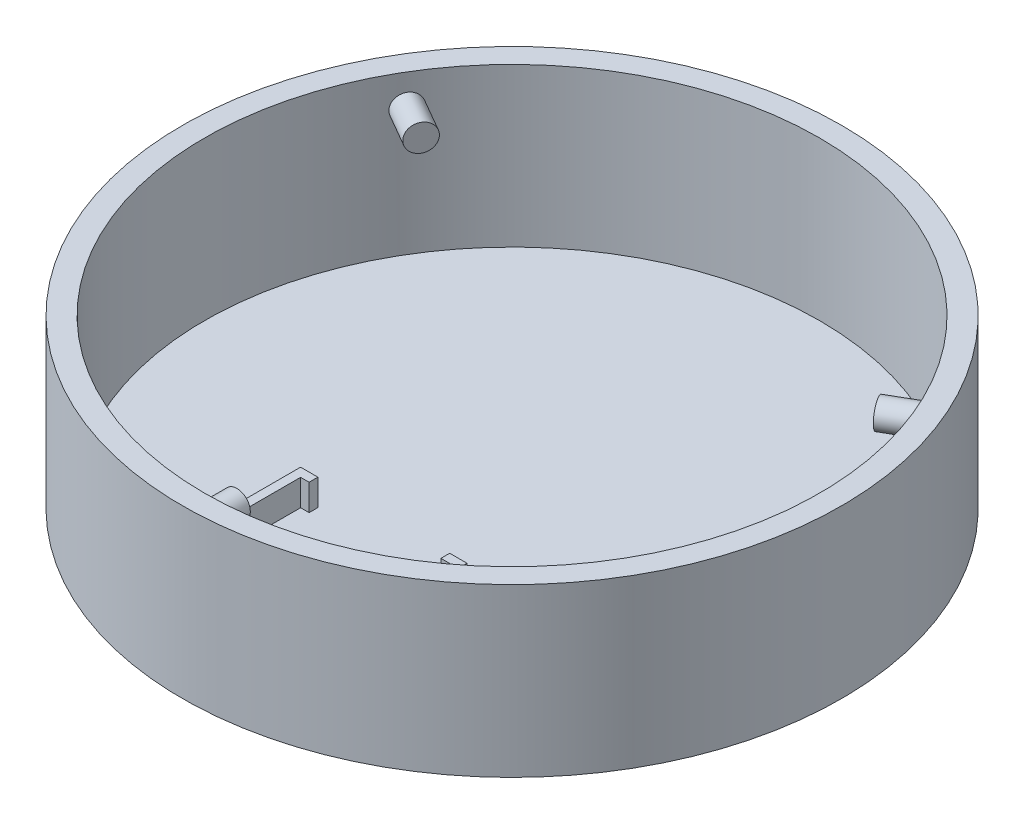
ISO-10303-21;
HEADER;
FILE_DESCRIPTION(('STEP AP214'),'2;1');
FILE_NAME('part.step','',(''),(''),'','','');
FILE_SCHEMA(('AUTOMOTIVE_DESIGN { 1 0 10303 214 1 1 1 1 }'));
ENDSEC;
DATA;
#1=APPLICATION_CONTEXT('core data for automotive mechanical design processes');
#2=APPLICATION_PROTOCOL_DEFINITION('international standard','automotive_design',2000,#1);
#3=PRODUCT_CONTEXT('',#1,'mechanical');
#4=PRODUCT('Part','Part','',(#3));
#5=PRODUCT_RELATED_PRODUCT_CATEGORY('part','',(#4));
#6=PRODUCT_DEFINITION_FORMATION('','',#4);
#7=PRODUCT_DEFINITION_CONTEXT('part definition',#1,'design');
#8=PRODUCT_DEFINITION('design','',#6,#7);
#9=PRODUCT_DEFINITION_SHAPE('','',#8);
#10=(LENGTH_UNIT() NAMED_UNIT(*) SI_UNIT(.MILLI.,.METRE.));
#11=(NAMED_UNIT(*) PLANE_ANGLE_UNIT() SI_UNIT($,.RADIAN.));
#12=(NAMED_UNIT(*) SI_UNIT($,.STERADIAN.) SOLID_ANGLE_UNIT());
#13=UNCERTAINTY_MEASURE_WITH_UNIT(LENGTH_MEASURE(1.E-05),#10,'distance_accuracy_value','');
#14=(GEOMETRIC_REPRESENTATION_CONTEXT(3) GLOBAL_UNCERTAINTY_ASSIGNED_CONTEXT((#13)) GLOBAL_UNIT_ASSIGNED_CONTEXT((#10,
#11,#12)) REPRESENTATION_CONTEXT('',''));
#15=CARTESIAN_POINT('',(0.,0.,0.));
#16=DIRECTION('',(0.,0.,1.));
#17=DIRECTION('',(1.,0.,0.));
#18=AXIS2_PLACEMENT_3D('',#15,#16,#17);
#19=CARTESIAN_POINT('',(17.3810889466934,10.16,30.4071253878576));
#20=DIRECTION('',(0.,0.,1.));
#21=DIRECTION('',(1.,0.,0.));
#22=AXIS2_PLACEMENT_3D('',#19,#20,#21);
#23=PLANE('',#22);
#24=DIRECTION('',(-1.,0.,0.));
#25=VECTOR('',#24,1.);
#26=CARTESIAN_POINT('',(17.3810889466934,10.16,30.4071253878576));
#27=LINE('',#26,#25);
#28=CARTESIAN_POINT('',(-25.7149110533066,10.16,30.4071253878576));
#29=VERTEX_POINT('',#28);
#30=CARTESIAN_POINT('',(-30.7149110533066,10.16,30.4071253878576));
#31=VERTEX_POINT('',#30);
#32=EDGE_CURVE('E197',#29,#31,#27,.T.);
#33=ORIENTED_EDGE('',*,*,#32,.F.);
#34=DIRECTION('',(0.,1.,0.));
#35=VECTOR('',#34,1.);
#36=CARTESIAN_POINT('',(-25.7149110533066,2.54,30.4071253878576));
#37=LINE('',#36,#35);
#38=CARTESIAN_POINT('',(-25.7149110533066,2.54,30.4071253878576));
#39=VERTEX_POINT('',#38);
#40=EDGE_CURVE('E189',#39,#29,#37,.T.);
#41=ORIENTED_EDGE('',*,*,#40,.F.);
#42=DIRECTION('',(-1.,0.,0.));
#43=VECTOR('',#42,1.);
#44=CARTESIAN_POINT('',(17.3810889466934,2.54,30.4071253878576));
#45=LINE('',#44,#43);
#46=CARTESIAN_POINT('',(-30.7149110533066,2.54,30.4071253878576));
#47=VERTEX_POINT('',#46);
#48=EDGE_CURVE('E216',#39,#47,#45,.T.);
#49=ORIENTED_EDGE('',*,*,#48,.T.);
#50=DIRECTION('',(0.,-1.,0.));
#51=VECTOR('',#50,1.);
#52=CARTESIAN_POINT('',(-30.7149110533066,10.16,30.4071253878576));
#53=LINE('',#52,#51);
#54=EDGE_CURVE('E232',#31,#47,#53,.T.);
#55=ORIENTED_EDGE('',*,*,#54,.F.);
#56=EDGE_LOOP('',(#33,#41,#49,#55));
#57=FACE_BOUND('',#56,.T.);
#58=ADVANCED_FACE('F69',(#57),#23,.F.);
#59=CARTESIAN_POINT('',(14.8410889466934,10.16,32.9471253878576));
#60=DIRECTION('',(0.,0.,1.));
#61=DIRECTION('',(1.,0.,0.));
#62=AXIS2_PLACEMENT_3D('',#59,#60,#61);
#63=PLANE('',#62);
#64=DIRECTION('',(0.,1.,0.));
#65=VECTOR('',#64,1.);
#66=CARTESIAN_POINT('',(-25.7149110533066,2.54,32.9471253878576));
#67=LINE('',#66,#65);
#68=CARTESIAN_POINT('',(-25.7149110533066,2.54,32.9471253878576));
#69=VERTEX_POINT('',#68);
#70=CARTESIAN_POINT('',(-25.7149110533066,10.16,32.9471253878576));
#71=VERTEX_POINT('',#70);
#72=EDGE_CURVE('E402',#69,#71,#67,.T.);
#73=ORIENTED_EDGE('',*,*,#72,.T.);
#74=DIRECTION('',(-1.,0.,0.));
#75=VECTOR('',#74,1.);
#76=CARTESIAN_POINT('',(14.8410889466934,10.16,32.9471253878576));
#77=LINE('',#76,#75);
#78=CARTESIAN_POINT('',(-28.1749110533066,10.16,32.9471253878576));
#79=VERTEX_POINT('',#78);
#80=EDGE_CURVE('E356',#71,#79,#77,.T.);
#81=ORIENTED_EDGE('',*,*,#80,.T.);
#82=DIRECTION('',(0.,-1.,0.));
#83=VECTOR('',#82,1.);
#84=CARTESIAN_POINT('',(-28.1749110533066,10.16,32.9471253878576));
#85=LINE('',#84,#83);
#86=CARTESIAN_POINT('',(-28.1749110533066,2.54,32.9471253878576));
#87=VERTEX_POINT('',#86);
#88=EDGE_CURVE('E205',#79,#87,#85,.T.);
#89=ORIENTED_EDGE('',*,*,#88,.T.);
#90=DIRECTION('',(-1.,0.,0.));
#91=VECTOR('',#90,1.);
#92=CARTESIAN_POINT('',(14.8410889466934,2.54,32.9471253878576));
#93=LINE('',#92,#91);
#94=EDGE_CURVE('E343',#69,#87,#93,.T.);
#95=ORIENTED_EDGE('',*,*,#94,.F.);
#96=EDGE_LOOP('',(#73,#81,#89,#95));
#97=FACE_BOUND('',#96,.T.);
#98=ADVANCED_FACE('F298',(#97),#63,.T.);
#99=CARTESIAN_POINT('',(0.,48.26,0.));
#100=DIRECTION('',(0.,-1.,0.));
#101=DIRECTION('',(0.,0.,-1.));
#102=AXIS2_PLACEMENT_3D('',#99,#100,#101);
#103=CYLINDRICAL_SURFACE('',#102,95.25);
#104=CARTESIAN_POINT('',(0.,48.26,0.));
#105=DIRECTION('',(0.,1.,0.));
#106=DIRECTION('',(0.,0.,1.));
#107=AXIS2_PLACEMENT_3D('',#104,#105,#106);
#108=CIRCLE('',#107,95.25);
#109=CARTESIAN_POINT('',(0.,48.26,-95.25));
#110=VERTEX_POINT('',#109);
#111=EDGE_CURVE('E12',#110,#110,#108,.T.);
#112=CARTESIAN_POINT('',(0.,0.,0.));
#113=DIRECTION('',(0.,1.,0.));
#114=DIRECTION('',(0.,0.,1.));
#115=AXIS2_PLACEMENT_3D('',#112,#113,#114);
#116=CIRCLE('',#115,95.25);
#117=CARTESIAN_POINT('',(0.,0.,-95.25));
#118=VERTEX_POINT('',#117);
#119=EDGE_CURVE('E84',#118,#118,#116,.T.);
#120=CARTESIAN_POINT('',(0.,48.26,-95.25));
#121=CARTESIAN_POINT('',(0.,47.7572916666667,-95.25));
#122=CARTESIAN_POINT('',(0.,47.2545833333333,-95.25));
#123=CARTESIAN_POINT('',(0.,46.2491666666667,-95.25));
#124=CARTESIAN_POINT('',(0.,45.7464583333333,-95.25));
#125=CARTESIAN_POINT('',(0.,44.7410416666667,-95.25));
#126=CARTESIAN_POINT('',(0.,44.2383333333333,-95.25));
#127=CARTESIAN_POINT('',(0.,43.2329166666667,-95.25));
#128=CARTESIAN_POINT('',(0.,42.7302083333333,-95.25));
#129=CARTESIAN_POINT('',(0.,41.7247916666667,-95.25));
#130=CARTESIAN_POINT('',(0.,41.2220833333333,-95.25));
#131=CARTESIAN_POINT('',(0.,40.2166666666667,-95.25));
#132=CARTESIAN_POINT('',(0.,39.7139583333333,-95.25));
#133=CARTESIAN_POINT('',(0.,38.7085416666667,-95.25));
#134=CARTESIAN_POINT('',(0.,38.2058333333333,-95.25));
#135=CARTESIAN_POINT('',(0.,37.2004166666667,-95.25));
#136=CARTESIAN_POINT('',(0.,36.6977083333333,-95.25));
#137=CARTESIAN_POINT('',(0.,35.6922916666667,-95.25));
#138=CARTESIAN_POINT('',(0.,35.1895833333333,-95.25));
#139=CARTESIAN_POINT('',(0.,34.1841666666667,-95.25));
#140=CARTESIAN_POINT('',(0.,33.6814583333333,-95.25));
#141=CARTESIAN_POINT('',(0.,32.6760416666667,-95.25));
#142=CARTESIAN_POINT('',(0.,32.1733333333333,-95.25));
#143=CARTESIAN_POINT('',(0.,31.1679166666667,-95.25));
#144=CARTESIAN_POINT('',(0.,30.6652083333333,-95.25));
#145=CARTESIAN_POINT('',(0.,29.6597916666667,-95.25));
#146=CARTESIAN_POINT('',(0.,29.1570833333333,-95.25));
#147=CARTESIAN_POINT('',(0.,28.1516666666667,-95.25));
#148=CARTESIAN_POINT('',(0.,27.6489583333333,-95.25));
#149=CARTESIAN_POINT('',(0.,26.6435416666667,-95.25));
#150=CARTESIAN_POINT('',(0.,26.1408333333333,-95.25));
#151=CARTESIAN_POINT('',(0.,25.1354166666667,-95.25));
#152=CARTESIAN_POINT('',(0.,24.6327083333333,-95.25));
#153=CARTESIAN_POINT('',(0.,23.6272916666667,-95.25));
#154=CARTESIAN_POINT('',(0.,23.1245833333333,-95.25));
#155=CARTESIAN_POINT('',(0.,22.1191666666667,-95.25));
#156=CARTESIAN_POINT('',(0.,21.6164583333333,-95.25));
#157=CARTESIAN_POINT('',(0.,20.6110416666667,-95.25));
#158=CARTESIAN_POINT('',(0.,20.1083333333333,-95.25));
#159=CARTESIAN_POINT('',(0.,19.1029166666667,-95.25));
#160=CARTESIAN_POINT('',(0.,18.6002083333333,-95.25));
#161=CARTESIAN_POINT('',(0.,17.5947916666667,-95.25));
#162=CARTESIAN_POINT('',(0.,17.0920833333333,-95.25));
#163=CARTESIAN_POINT('',(0.,16.0866666666667,-95.25));
#164=CARTESIAN_POINT('',(0.,15.5839583333333,-95.25));
#165=CARTESIAN_POINT('',(0.,14.5785416666667,-95.25));
#166=CARTESIAN_POINT('',(0.,14.0758333333333,-95.25));
#167=CARTESIAN_POINT('',(0.,13.0704166666667,-95.25));
#168=CARTESIAN_POINT('',(0.,12.5677083333333,-95.25));
#169=CARTESIAN_POINT('',(0.,11.5622916666667,-95.25));
#170=CARTESIAN_POINT('',(0.,11.0595833333333,-95.25));
#171=CARTESIAN_POINT('',(0.,10.0541666666667,-95.25));
#172=CARTESIAN_POINT('',(0.,9.55145833333333,-95.25));
#173=CARTESIAN_POINT('',(0.,8.54604166666666,-95.25));
#174=CARTESIAN_POINT('',(0.,8.04333333333333,-95.25));
#175=CARTESIAN_POINT('',(0.,7.03791666666666,-95.25));
#176=CARTESIAN_POINT('',(0.,6.53520833333333,-95.25));
#177=CARTESIAN_POINT('',(0.,5.52979166666666,-95.25));
#178=CARTESIAN_POINT('',(0.,5.02708333333333,-95.25));
#179=CARTESIAN_POINT('',(0.,4.02166666666666,-95.25));
#180=CARTESIAN_POINT('',(0.,3.51895833333333,-95.25));
#181=CARTESIAN_POINT('',(0.,2.51354166666666,-95.25));
#182=CARTESIAN_POINT('',(0.,2.01083333333333,-95.25));
#183=CARTESIAN_POINT('',(0.,1.00541666666666,-95.25));
#184=CARTESIAN_POINT('',(0.,0.502708333333326,-95.25));
#185=CARTESIAN_POINT('',(0.,0.,-95.25));
#186=B_SPLINE_CURVE_WITH_KNOTS('',3,(#120,#121,#122,#123,#124,#125,#126,#127,#128,#129,#130,
#131,#132,#133,#134,#135,#136,#137,#138,#139,#140,#141,#142,#143,#144,#145,#146,#147,#148,#149,
#150,#151,#152,#153,#154,#155,#156,#157,#158,#159,#160,#161,#162,#163,#164,#165,#166,#167,#168,
#169,#170,#171,#172,#173,#174,#175,#176,#177,#178,#179,#180,#181,#182,#183,#184,#185),
.UNSPECIFIED.,.F.,.F.,(4,2,2,2,2,2,2,2,2,2,2,2,2,2,2,2,2,2,2,2,2,2,2,2,2,2,2,2,2,2,2,2,4),(0.,
1.50812500000001,3.01625000000001,4.524375,6.0325,7.540625,9.04875,10.556875,12.065,13.573125,
15.08125,16.589375,18.0975,19.605625,21.11375,22.621875,24.13,25.638125,27.14625,28.654375,
30.1625,31.670625,33.17875,34.686875,36.195,37.703125,39.21125,40.719375,42.2275,43.735625,
45.24375,46.751875,48.26),.UNSPECIFIED.);
#187=EDGE_CURVE('BSEAM71',#110,#118,#186,.T.);
#188=ORIENTED_EDGE('',*,*,#111,.F.);
#189=ORIENTED_EDGE('',*,*,#119,.T.);
#190=ORIENTED_EDGE('',*,*,#187,.T.);
#191=ORIENTED_EDGE('',*,*,#187,.F.);
#192=EDGE_LOOP('',(#188,#190,#189,#191));
#193=FACE_BOUND('',#192,.T.);
#194=ADVANCED_FACE('F71',(#193),#103,.T.);
#195=CARTESIAN_POINT('',(0.,48.26,0.));
#196=DIRECTION('',(0.,1.,0.));
#197=DIRECTION('',(0.,0.,1.));
#198=AXIS2_PLACEMENT_3D('',#195,#196,#197);
#199=PLANE('',#198);
#200=CARTESIAN_POINT('',(0.,48.26,0.));
#201=DIRECTION('',(0.,1.,0.));
#202=DIRECTION('',(0.,0.,1.));
#203=AXIS2_PLACEMENT_3D('',#200,#201,#202);
#204=CIRCLE('',#203,88.9);
#205=CARTESIAN_POINT('',(0.,48.26,88.9));
#206=VERTEX_POINT('',#205);
#207=EDGE_CURVE('E254',#206,#206,#204,.T.);
#208=ORIENTED_EDGE('',*,*,#207,.F.);
#209=EDGE_LOOP('',(#208));
#210=FACE_BOUND('',#209,.T.);
#211=ORIENTED_EDGE('',*,*,#111,.T.);
#212=EDGE_LOOP('',(#211));
#213=FACE_BOUND('',#212,.T.);
#214=ADVANCED_FACE('F545',(#210,#213),#199,.T.);
#215=CARTESIAN_POINT('',(0.,0.,0.));
#216=DIRECTION('',(0.,1.,0.));
#217=DIRECTION('',(0.,0.,1.));
#218=AXIS2_PLACEMENT_3D('',#215,#216,#217);
#219=PLANE('',#218);
#220=ORIENTED_EDGE('',*,*,#119,.F.);
#221=EDGE_LOOP('',(#220));
#222=FACE_BOUND('',#221,.T.);
#223=ADVANCED_FACE('F549',(#222),#219,.F.);
#224=CARTESIAN_POINT('',(0.,2.54,0.));
#225=DIRECTION('',(0.,1.,0.));
#226=DIRECTION('',(0.,0.,1.));
#227=AXIS2_PLACEMENT_3D('',#224,#225,#226);
#228=CYLINDRICAL_SURFACE('',#227,88.9);
#229=CARTESIAN_POINT('',(79.5929794989805,39.26,-39.6000961422428));
#230=CARTESIAN_POINT('',(79.5929758198982,39.0425887767114,-39.6001051451292));
#231=CARTESIAN_POINT('',(79.5847910182511,38.8250224354021,-39.6165675609572));
#232=CARTESIAN_POINT('',(79.5521996257889,38.3958929375781,-39.6819709444511));
#233=CARTESIAN_POINT('',(79.5277738156264,38.1843372035765,-39.7309503921424));
#234=CARTESIAN_POINT('',(79.46323308593,37.7735112511927,-39.8598764942506));
#235=CARTESIAN_POINT('',(79.4231264635019,37.5742346000885,-39.9398067716032));
#236=CARTESIAN_POINT('',(79.3281156362433,37.1935526996715,-40.1281839101891));
#237=CARTESIAN_POINT('',(79.273214920508,37.0121432502473,-40.2366240474016));
#238=CARTESIAN_POINT('',(79.1497678759937,36.6720357950269,-40.4789167223367));
#239=CARTESIAN_POINT('',(79.081204782356,36.5133661081465,-40.6128004720219));
#240=CARTESIAN_POINT('',(78.9320619837048,36.2234775197614,-40.9019069491397));
#241=CARTESIAN_POINT('',(78.851481735383,36.0922598600368,-41.0571306413489));
#242=CARTESIAN_POINT('',(78.6801397210465,35.8608485038301,-41.3845350455569));
#243=CARTESIAN_POINT('',(78.5893656144512,35.7606929745236,-41.5567362789451));
#244=CARTESIAN_POINT('',(78.4000000623118,35.5944738083307,-41.9128933142008));
#245=CARTESIAN_POINT('',(78.3014086474818,35.5284100375057,-42.0968490698844));
#246=CARTESIAN_POINT('',(78.0990414359978,35.4322845430014,-42.471107117498));
#247=CARTESIAN_POINT('',(77.9952676586307,35.4022089089622,-42.6614069280306));
#248=CARTESIAN_POINT('',(77.7853545021627,35.3788865025105,-43.0429556166875));
#249=CARTESIAN_POINT('',(77.6792151444547,35.3856393971766,-43.2342044862169));
#250=CARTESIAN_POINT('',(77.4677393426387,35.4357652431191,-43.611995853298));
#251=CARTESIAN_POINT('',(77.3624021002806,35.4790950660853,-43.7985436272992));
#252=CARTESIAN_POINT('',(77.1555350256693,35.6010939302572,-44.1619424238062));
#253=CARTESIAN_POINT('',(77.0540051890898,35.6797629313063,-44.3387934573304));
#254=CARTESIAN_POINT('',(76.8579133789179,35.8701680785282,-44.6778416323216));
#255=CARTESIAN_POINT('',(76.7633486234969,35.9818909326813,-44.8400446300787));
#256=CARTESIAN_POINT('',(76.5841313797801,36.2352453443452,-45.1454562946207));
#257=CARTESIAN_POINT('',(76.4994789204995,36.3768769894008,-45.288664905806));
#258=CARTESIAN_POINT('',(76.3427896110524,36.6861148680796,-45.5523002486622));
#259=CARTESIAN_POINT('',(76.2707593658409,36.8537346148128,-45.6727150554144));
#260=CARTESIAN_POINT('',(76.1417560986276,37.2101426369181,-45.887457125731));
#261=CARTESIAN_POINT('',(76.0847831076065,37.398930955844,-45.9817843356195));
#262=CARTESIAN_POINT('',(75.9877979970046,37.792398760094,-46.1418829612074));
#263=CARTESIAN_POINT('',(75.9477922607391,37.997084191929,-46.2076436300051));
#264=CARTESIAN_POINT('',(75.8861416457657,38.4164742385188,-46.3088225505772));
#265=CARTESIAN_POINT('',(75.8644967331612,38.6311788347761,-46.3442408583677));
#266=CARTESIAN_POINT('',(75.8403173317584,39.0644620622004,-46.3837990730513));
#267=CARTESIAN_POINT('',(75.8377786480412,39.2830398324181,-46.3879458458499));
#268=CARTESIAN_POINT('',(75.8518885262761,39.7179080606757,-46.3648701362989));
#269=CARTESIAN_POINT('',(75.868537075118,39.9341985202785,-46.3376476753833));
#270=CARTESIAN_POINT('',(75.9204419116952,40.3583164410198,-46.2525562241077));
#271=CARTESIAN_POINT('',(75.9556951598263,40.5661452786311,-46.1946922399027));
#272=CARTESIAN_POINT('',(76.0435989996554,40.9674829435946,-46.0498445906337));
#273=CARTESIAN_POINT('',(76.0962496312858,41.1609917380766,-45.9628608587306));
#274=CARTESIAN_POINT('',(76.2171813674947,41.5282521698166,-45.7620470853653));
#275=CARTESIAN_POINT('',(76.2854666270952,41.7019985366532,-45.6482099071503));
#276=CARTESIAN_POINT('',(76.4353840178553,42.0247466089832,-45.3967338202294));
#277=CARTESIAN_POINT('',(76.5170161625555,42.1737482893726,-45.2590948873763));
#278=CARTESIAN_POINT('',(76.690967770721,42.4427875712459,-44.9637052193187));
#279=CARTESIAN_POINT('',(76.7832880340355,42.5628230029541,-44.8059529788379));
#280=CARTESIAN_POINT('',(76.9756662801889,42.770503304993,-44.474638239037));
#281=CARTESIAN_POINT('',(77.0757242220307,42.8581483469256,-44.3010758234841));
#282=CARTESIAN_POINT('',(77.2804204422942,42.9985199151308,-43.9430208879394));
#283=CARTESIAN_POINT('',(77.3850562616718,43.0512649485615,-43.7585342176238));
#284=CARTESIAN_POINT('',(77.5958190885301,43.1204179185624,-43.3836959333607));
#285=CARTESIAN_POINT('',(77.7019460941333,43.1368259008796,-43.1933443267973));
#286=CARTESIAN_POINT('',(77.912587727743,43.1328519423419,-42.8122186526074));
#287=CARTESIAN_POINT('',(78.0171028862169,43.1124823775151,-42.6214447486641));
#288=CARTESIAN_POINT('',(78.2216606445408,43.0355722498535,-42.2448546309024));
#289=CARTESIAN_POINT('',(78.3217032147328,42.9790314472044,-42.0590384499622));
#290=CARTESIAN_POINT('',(78.5147350346616,42.8313397220287,-41.6975830036456));
#291=CARTESIAN_POINT('',(78.6077188785595,42.7401625882162,-41.5219515619523));
#292=CARTESIAN_POINT('',(78.7841851519857,42.5257958442334,-41.1861408212087));
#293=CARTESIAN_POINT('',(78.867667866949,42.4026071961254,-41.0259610579776));
#294=CARTESIAN_POINT('',(79.0231851195763,42.127559408817,-40.7256049412756));
#295=CARTESIAN_POINT('',(79.0952078457103,41.9756710376178,-40.5854492411089));
#296=CARTESIAN_POINT('',(79.2260293384409,41.6475528068791,-40.3294805093061));
#297=CARTESIAN_POINT('',(79.2848248653854,41.4713170011032,-40.2136734416761));
#298=CARTESIAN_POINT('',(79.3878508100348,41.0994799624709,-40.0099016097811));
#299=CARTESIAN_POINT('',(79.4320758972624,40.9038716763119,-39.9219470355808));
#300=CARTESIAN_POINT('',(79.5049110579353,40.49903671584,-39.776698987093));
#301=CARTESIAN_POINT('',(79.5335397640023,40.2898266273816,-39.7193689280347));
#302=CARTESIAN_POINT('',(79.5670147027677,39.9427504694273,-39.6522502495368));
#303=CARTESIAN_POINT('',(79.5767416269906,39.8071423489891,-39.6327189033487));
#304=CARTESIAN_POINT('',(79.5897251819083,39.5343767481783,-39.6066390170729));
#305=CARTESIAN_POINT('',(79.5929818210363,39.3972192698253,-39.6000904600638));
#306=CARTESIAN_POINT('',(79.5929794989805,39.26,-39.6000961422428));
#307=B_SPLINE_CURVE_WITH_KNOTS('',3,(#229,#230,#231,#232,#233,#234,#235,#236,#237,#238,#239,
#240,#241,#242,#243,#244,#245,#246,#247,#248,#249,#250,#251,#252,#253,#254,#255,#256,#257,#258,
#259,#260,#261,#262,#263,#264,#265,#266,#267,#268,#269,#270,#271,#272,#273,#274,#275,#276,#277,
#278,#279,#280,#281,#282,#283,#284,#285,#286,#287,#288,#289,#290,#291,#292,#293,#294,#295,#296,
#297,#298,#299,#300,#301,#302,#303,#304,#305,#306),.UNSPECIFIED.,.T.,.F.,(4,2,2,2,2,2,2,2,2,2,2,
2,2,2,2,2,2,2,2,2,2,2,2,2,2,2,2,2,2,2,2,2,2,2,2,2,2,2,4),(0.,0.651732462151286,1.3042375498933,
1.95639784728063,2.60840447110579,3.26121614272859,3.91405733760922,4.56769755298959,
5.22133520034976,5.87472011790128,6.52809912901489,7.18070880719647,7.83331774380705,
8.48566460121314,9.13801336810159,9.79070248340624,10.4433929416268,11.0963287336524,
11.7492633202663,12.4020545459053,13.0548453255068,13.7075294862572,14.3602151451318,
15.0130744619621,15.6659344411296,16.3188433089288,16.9717487176137,17.6243076184056,
18.2768656976507,18.9292042252239,19.5815470778269,20.2343845820627,20.8872024684295,
21.5406888997783,22.1943352114919,22.8482203895558,23.5013226640023,23.9126646719579,
24.3240061437785),.UNSPECIFIED.);
#308=CARTESIAN_POINT('',(79.5929794989805,39.26,-39.6000961422428));
#309=VERTEX_POINT('',#308);
#310=EDGE_CURVE('E73',#309,#309,#307,.T.);
#311=ORIENTED_EDGE('',*,*,#310,.T.);
#312=EDGE_LOOP('',(#311));
#313=FACE_BOUND('',#312,.T.);
#314=CARTESIAN_POINT('',(-74.0911790009789,39.26,-49.1294941378894));
#315=CARTESIAN_POINT('',(-74.091184958166,39.0425887767114,-49.1294864502674));
#316=CARTESIAN_POINT('',(-74.1013494276572,38.8250224354021,-49.1141669962022));
#317=CARTESIAN_POINT('',(-74.1416947230254,38.3958929375781,-49.0532403306382));
#318=CARTESIAN_POINT('',(-74.1718992639081,38.1843372035765,-49.0075972346838));
#319=CARTESIAN_POINT('',(-74.2512821786965,37.7735112511927,-48.8872402721338));
#320=CARTESIAN_POINT('',(-74.3004505182013,37.5742346000885,-48.8125417795748));
#321=CARTESIAN_POINT('',(-74.4160844920796,37.1935526996715,-48.6360714202413));
#322=CARTESIAN_POINT('',(-74.4825460478279,37.0121432502473,-48.5343059371224));
#323=CARTESIAN_POINT('',(-74.6306541372154,36.6720357950269,-48.3062513230833));
#324=CARTESIAN_POINT('',(-74.7123193187778,36.5133661081465,-48.1799320673885));
#325=CARTESIAN_POINT('',(-74.8881214730349,36.2234775197614,-47.9062173764061));
#326=CARTESIAN_POINT('',(-74.9822590095964,36.0922598600368,-47.7588209882115));
#327=CARTESIAN_POINT('',(-75.1801285337832,35.8608485038301,-47.4467322489565));
#328=CARTESIAN_POINT('',(-75.2838721231627,35.7606929745236,-47.2820189499451));
#329=CARTESIAN_POINT('',(-75.4976303873609,35.5944738083307,-46.9399450535628));
#330=CARTESIAN_POINT('',(-75.6076450375403,35.5284100375057,-46.7625845058832));
#331=CARTESIAN_POINT('',(-75.8305784086024,35.4322845430014,-46.4002003360382));
#332=CARTESIAN_POINT('',(-75.9434959901755,35.4022089089622,-46.2151797033254));
#333=CARTESIAN_POINT('',(-76.168970269099,35.3788865025105,-45.842615232907));
#334=CARTESIAN_POINT('',(-76.2815269697025,35.3856393971766,-45.6550714180258));
#335=CARTESIAN_POINT('',(-76.5029659900172,35.4357652431191,-45.283032317827));
#336=CARTESIAN_POINT('',(-76.6118524801426,35.4790950660853,-45.0985337029796));
#337=CARTESIAN_POINT('',(-76.8231315323168,35.6010939302572,-44.7376821629062));
#338=CARTESIAN_POINT('',(-76.9255241017445,35.6797629313063,-44.5613292284242));
#339=CARTESIAN_POINT('',(-77.1211025293077,35.8701680785282,-44.2219846518457));
#340=CARTESIAN_POINT('',(-77.2142920682248,35.9818909326812,-44.0589876724698));
#341=CARTESIAN_POINT('',(-77.3891777064719,36.2352453443452,-43.7510751543439));
#342=CARTESIAN_POINT('',(-77.4708737721588,36.3768769894008,-43.6061596685214));
#343=CARTESIAN_POINT('',(-77.6208440216841,36.6861148680796,-43.3386450746107));
#344=CARTESIAN_POINT('',(-77.6891111807175,36.8537346148128,-43.2160576490406));
#345=CARTESIAN_POINT('',(-77.8105816352663,37.2101426369181,-42.9969665073044));
#346=CARTESIAN_POINT('',(-77.8637848997873,37.398930955844,-42.9004628448063));
#347=CARTESIAN_POINT('',(-77.9539418213564,37.792398760094,-42.7364219624423));
#348=CARTESIAN_POINT('',(-77.9908893629724,37.997084191929,-42.6688956441404));
#349=CARTESIAN_POINT('',(-78.0476875710286,38.4164742385188,-42.5649151851284));
#350=CARTESIAN_POINT('',(-78.067538269032,38.6311788347761,-42.528460987055));
#351=CARTESIAN_POINT('',(-78.0897069871749,39.0644620622004,-42.4877419038501));
#352=CARTESIAN_POINT('',(-78.0920288559036,39.2830398324181,-42.4834699528595));
#353=CARTESIAN_POINT('',(-78.0790996443395,39.7179080606757,-42.5072273206306));
#354=CARTESIAN_POINT('',(-78.063848576054,39.9341985202785,-42.5352566173217));
#355=CARTESIAN_POINT('',(-78.0161096358931,40.3583164410198,-42.6227532500147));
#356=CARTESIAN_POINT('',(-77.983624579673,40.5661452786311,-42.6822154505646));
#357=CARTESIAN_POINT('',(-77.9021347556421,40.9674829435946,-42.8307662335813));
#358=CARTESIAN_POINT('',(-77.8531299499133,41.1609917380766,-42.9198548840501));
#359=CARTESIAN_POINT('',(-77.7396859888535,41.5282521698166,-43.1249917264134));
#360=CARTESIAN_POINT('',(-77.6752427304244,41.7019985366532,-43.2410470850389));
#361=CARTESIAN_POINT('',(-77.5324167460867,42.0247466089832,-43.4966173973667));
#362=CARTESIAN_POINT('',(-77.4540340060362,42.1737482893726,-43.636132374869));
#363=CARTESIAN_POINT('',(-77.2851948535656,42.4427875712459,-43.9344737205983));
#364=CARTESIAN_POINT('',(-77.1947375374626,42.5628230029541,-44.0933015341532));
#365=CARTESIAN_POINT('',(-77.0039996792235,42.770503304993,-44.4255633523579));
#366=CARTESIAN_POINT('',(-76.9037191891334,42.8581483469257,-44.5989972796198));
#367=CARTESIAN_POINT('',(-76.695982629133,42.9985199151308,-44.955296874199));
#368=CARTESIAN_POINT('',(-76.5885303956689,43.0512649485615,-45.1381574870836));
#369=CARTESIAN_POINT('',(-76.3692923326153,43.1204179185624,-45.5081025914479));
#370=CARTESIAN_POINT('',(-76.2575065084818,43.1368259008796,-45.6951870776095));
#371=CARTESIAN_POINT('',(-76.0327628094037,43.1328519423419,-46.0681709205051));
#372=CARTESIAN_POINT('',(-75.9198053414466,43.1124823775151,-46.2540706547957));
#373=CARTESIAN_POINT('',(-75.6959476118128,43.0355722498535,-46.6195179289262));
#374=CARTESIAN_POINT('',(-75.5850473637803,42.9790314472044,-46.7990654266425));
#375=CARTESIAN_POINT('',(-75.3685336748983,42.8313397220287,-47.1469636095979));
#376=CARTESIAN_POINT('',(-75.2629243066376,42.7401625882162,-47.3153057014016));
#377=CARTESIAN_POINT('',(-75.060336811003,42.5257958442334,-47.6360353474717));
#378=CARTESIAN_POINT('',(-74.9633584243544,42.4026071961254,-47.7884233810224));
#379=CARTESIAN_POINT('',(-74.781001023422,42.127559408817,-48.0732833308754));
#380=CARTESIAN_POINT('',(-74.6956339896595,41.9756710376178,-48.2057346914406));
#381=CARTESIAN_POINT('',(-74.5393693117091,41.6475528068791,-48.4470137934077));
#382=CARTESIAN_POINT('',(-74.468475212676,41.4713170011032,-48.5558357471855));
#383=CARTESIAN_POINT('',(-74.3435166020039,41.0994799624709,-48.7469447484482));
#384=CARTESIAN_POINT('',(-74.2894582499813,40.9038716763119,-48.8292220845721));
#385=CARTESIAN_POINT('',(-74.2000873304771,40.49903671584,-48.9649232082475));
#386=CARTESIAN_POINT('',(-74.1647523959657,40.2898266273816,-49.0183814245081));
#387=CARTESIAN_POINT('',(-74.1233633847008,39.9427504694273,-49.080930911118));
#388=CARTESIAN_POINT('',(-74.1113122048433,39.8071423489891,-49.0991203476898));
#389=CARTESIAN_POINT('',(-74.0952181382595,39.5343767481783,-49.1234043792178));
#390=CARTESIAN_POINT('',(-74.0911752410954,39.3972192698253,-49.1294989899382));
#391=CARTESIAN_POINT('',(-74.0911790009789,39.26,-49.1294941378894));
#392=B_SPLINE_CURVE_WITH_KNOTS('',3,(#314,#315,#316,#317,#318,#319,#320,#321,#322,#323,#324,
#325,#326,#327,#328,#329,#330,#331,#332,#333,#334,#335,#336,#337,#338,#339,#340,#341,#342,#343,
#344,#345,#346,#347,#348,#349,#350,#351,#352,#353,#354,#355,#356,#357,#358,#359,#360,#361,#362,
#363,#364,#365,#366,#367,#368,#369,#370,#371,#372,#373,#374,#375,#376,#377,#378,#379,#380,#381,
#382,#383,#384,#385,#386,#387,#388,#389,#390,#391),.UNSPECIFIED.,.T.,.F.,(4,2,2,2,2,2,2,2,2,2,2,
2,2,2,2,2,2,2,2,2,2,2,2,2,2,2,2,2,2,2,2,2,2,2,2,2,2,2,4),(0.,0.65173246215128,1.3042375498933,
1.95639784728063,2.60840447110579,3.26121614272858,3.91405733760923,4.56769755298959,
5.22133520034976,5.87472011790127,6.52809912901489,7.18070880719647,7.83331774380705,
8.48566460121314,9.13801336810159,9.79070248340624,10.4433929416268,11.0963287336524,
11.7492633202663,12.4020545459053,13.0548453255068,13.7075294862572,14.3602151451318,
15.0130744619621,15.6659344411296,16.3188433089288,16.9717487176137,17.6243076184056,
18.2768656976507,18.9292042252239,19.5815470778269,20.2343845820627,20.8872024684295,
21.5406888997783,22.1943352114919,22.8482203895558,23.5013226640023,23.9126646719579,
24.3240061437785),.UNSPECIFIED.);
#393=CARTESIAN_POINT('',(-74.0911790009789,39.26,-49.1294941378894));
#394=VERTEX_POINT('',#393);
#395=EDGE_CURVE('E244',#394,#394,#392,.T.);
#396=ORIENTED_EDGE('',*,*,#395,.T.);
#397=EDGE_LOOP('',(#396));
#398=FACE_BOUND('',#397,.T.);
#399=CARTESIAN_POINT('',(0.,35.7430204521914,88.9));
#400=CARTESIAN_POINT('',(0.197518261287702,35.8343943157047,88.8999993546398));
#401=CARTESIAN_POINT('',(0.38746283851697,35.9425117734692,88.8993361545189));
#402=CARTESIAN_POINT('',(0.746657430349966,36.1891862385074,88.8970467437268));
#403=CARTESIAN_POINT('',(0.915882533227581,36.3277793388845,88.895419387275));
#404=CARTESIAN_POINT('',(1.22859178769886,36.6313499644598,88.8916477178999));
#405=CARTESIAN_POINT('',(1.3720885102462,36.7963145295497,88.8895036586461));
#406=CARTESIAN_POINT('',(1.62931634257253,37.1479448932025,88.8851614904845));
#407=CARTESIAN_POINT('',(1.74305471882459,37.3346053778894,88.8829633949152));
#408=CARTESIAN_POINT('',(1.93762929400889,37.7244422357821,88.8789351245105));
#409=CARTESIAN_POINT('',(2.01845358563395,37.9276245542474,88.8771050829468));
#410=CARTESIAN_POINT('',(2.14484493198946,38.3446873880155,88.8741451111216));
#411=CARTESIAN_POINT('',(2.19041069254742,38.5585682957058,88.873015206559));
#412=CARTESIAN_POINT('',(2.2449784518139,38.990900600355,88.8716536955828));
#413=CARTESIAN_POINT('',(2.25398834064723,39.209351000814,88.8714218953252));
#414=CARTESIAN_POINT('',(2.23520956503546,39.6446627235601,88.8718961288089));
#415=CARTESIAN_POINT('',(2.20742100287199,39.8615240502624,88.8726021599434));
#416=CARTESIAN_POINT('',(2.11584461335516,40.2874610147499,88.8748292544667));
#417=CARTESIAN_POINT('',(2.05206342300656,40.4965380803703,88.8763501675894));
#418=CARTESIAN_POINT('',(1.89031853442046,40.9010180587796,88.8799369914471));
#419=CARTESIAN_POINT('',(1.79235481831903,41.0964209644223,88.882002902467));
#420=CARTESIAN_POINT('',(1.5649952180821,41.4680600220804,88.8862962982285));
#421=CARTESIAN_POINT('',(1.43559140744768,41.6442913244128,88.888523823616));
#422=CARTESIAN_POINT('',(1.14903391637241,41.9725325334948,88.8926892220131));
#423=CARTESIAN_POINT('',(0.991880182609159,42.1245423937011,88.8946270944661));
#424=CARTESIAN_POINT('',(0.654261628473727,42.4000408911658,88.897752430434));
#425=CARTESIAN_POINT('',(0.473794343217484,42.5235265087723,88.8989398145233));
#426=CARTESIAN_POINT('',(0.0946858982312174,42.7384461264682,88.9001513817855));
#427=CARTESIAN_POINT('',(-0.103955180440685,42.8298802695036,88.9001755701463));
#428=CARTESIAN_POINT('',(-0.513660494481493,42.9780605507299,88.8987517351839));
#429=CARTESIAN_POINT('',(-0.724718377703659,43.0348242592124,88.8973044585627));
#430=CARTESIAN_POINT('',(-1.15334914891377,43.1121284530183,88.8927764300176));
#431=CARTESIAN_POINT('',(-1.37092201572348,43.1326690560791,88.8896956834031));
#432=CARTESIAN_POINT('',(-1.80631749000437,43.1369547366784,88.8819138304065));
#433=CARTESIAN_POINT('',(-2.02413997198981,43.1207137196429,88.8772133369452));
#434=CARTESIAN_POINT('',(-2.45394198496056,43.0519424451329,88.866385090646));
#435=CARTESIAN_POINT('',(-2.66592149092483,42.9994120322836,88.8602573316972));
#436=CARTESIAN_POINT('',(-3.07818171231923,42.8595183242387,88.8469323890827));
#437=CARTESIAN_POINT('',(-3.27845436965477,42.7721313527705,88.8397344806081));
#438=CARTESIAN_POINT('',(-3.66148596974551,42.5650089747664,88.8247730275093));
#439=CARTESIAN_POINT('',(-3.84424476496533,42.4452732957601,88.8170094781213));
#440=CARTESIAN_POINT('',(-4.18728531524675,42.1766848922275,88.8014989176429));
#441=CARTESIAN_POINT('',(-4.34754097806546,42.0277988389954,88.7937519358419));
#442=CARTESIAN_POINT('',(-4.64078409596043,41.7052079468177,88.7789092831694));
#443=CARTESIAN_POINT('',(-4.77377152846194,41.5315030873254,88.7718136128371));
#444=CARTESIAN_POINT('',(-5.00869510854091,41.1641900816913,88.7588692183146));
#445=CARTESIAN_POINT('',(-5.11063153720064,40.9705821157391,88.753020482837));
#446=CARTESIAN_POINT('',(-5.28053932686059,40.5689536728542,88.7430740323283));
#447=CARTESIAN_POINT('',(-5.34851100444869,40.3609333302808,88.7389763009761));
#448=CARTESIAN_POINT('',(-5.44846121076098,39.9367198295976,88.7328958109515));
#449=CARTESIAN_POINT('',(-5.48049387265518,39.7205394716222,88.7309098716269));
#450=CARTESIAN_POINT('',(-5.50782847660267,39.2858611734291,88.729217402151));
#451=CARTESIAN_POINT('',(-5.50313078309946,39.0673632562279,88.7295108493832));
#452=CARTESIAN_POINT('',(-5.45717048970588,38.634546944906,88.7323492672175));
#453=CARTESIAN_POINT('',(-5.41595465169123,38.4202235638229,88.7348913584));
#454=CARTESIAN_POINT('',(-5.29820422743188,38.0015447824731,88.7419995304807));
#455=CARTESIAN_POINT('',(-5.22166947580551,37.7971894288868,88.7465656208563));
#456=CARTESIAN_POINT('',(-5.03541450615325,37.4041171414325,88.7573279368356));
#457=CARTESIAN_POINT('',(-4.92567603600004,37.2154088816659,88.763525058775));
#458=CARTESIAN_POINT('',(-4.6761465244424,36.8590784404979,88.7770196163981));
#459=CARTESIAN_POINT('',(-4.5363551107824,36.6914565203266,88.7843170657108));
#460=CARTESIAN_POINT('',(-4.23041232731472,36.3817558100721,88.7994203331845));
#461=CARTESIAN_POINT('',(-4.06421651317767,36.2397209644602,88.807226995163));
#462=CARTESIAN_POINT('',(-3.7103440071224,35.9855649848666,88.8227147622857));
#463=CARTESIAN_POINT('',(-3.52266802996081,35.8734428559466,88.8303958715981));
#464=CARTESIAN_POINT('',(-3.13100474771863,35.6822185607183,88.8450628685651));
#465=CARTESIAN_POINT('',(-2.9270065597555,35.6031386477216,88.85204828528));
#466=CARTESIAN_POINT('',(-2.50853361677052,35.4803540127211,88.8648470932201));
#467=CARTESIAN_POINT('',(-2.2940563681092,35.4366577546563,88.8706602037743));
#468=CARTESIAN_POINT('',(-1.86086813301597,35.3859325557038,88.8807859292604));
#469=CARTESIAN_POINT('',(-1.64215861968382,35.3788910790745,88.8850990567076));
#470=CARTESIAN_POINT('',(-1.20682111864976,35.4016785912942,88.8920741537133));
#471=CARTESIAN_POINT('',(-0.990190962646349,35.4314636906369,88.8947380830938));
#472=CARTESIAN_POINT('',(-0.643894834065787,35.509215344212,88.8977696149699));
#473=CARTESIAN_POINT('',(-0.511710012703896,35.5463765051032,88.8986221719337));
#474=CARTESIAN_POINT('',(-0.252013739738633,35.6344810850505,88.8997375675113));
#475=CARTESIAN_POINT('',(-0.124502282852193,35.6854244885258,88.9000004067919));
#476=CARTESIAN_POINT('',(0.,35.7430204521914,88.9));
#477=B_SPLINE_CURVE_WITH_KNOTS('',3,(#399,#400,#401,#402,#403,#404,#405,#406,#407,#408,#409,
#410,#411,#412,#413,#414,#415,#416,#417,#418,#419,#420,#421,#422,#423,#424,#425,#426,#427,#428,
#429,#430,#431,#432,#433,#434,#435,#436,#437,#438,#439,#440,#441,#442,#443,#444,#445,#446,#447,
#448,#449,#450,#451,#452,#453,#454,#455,#456,#457,#458,#459,#460,#461,#462,#463,#464,#465,#466,
#467,#468,#469,#470,#471,#472,#473,#474,#475,#476),.UNSPECIFIED.,.T.,.F.,(4,2,2,2,2,2,2,2,2,2,2,
2,2,2,2,2,2,2,2,2,2,2,2,2,2,2,2,2,2,2,2,2,2,2,2,2,2,2,4),(0.,0.652388054494849,1.30555295104813,
1.95839783463808,2.61108315571493,3.26400438902482,3.91694958682218,4.56975384711734,
5.22255629294102,5.87523840196088,6.52792085207553,7.1807680238619,7.83361645012948,
8.48653395702201,9.13944855193655,9.79203198748866,10.4446133019203,11.0969479467858,
11.7492853846718,12.4020666785466,13.054853470916,13.708391023638,14.3619291174066,
15.0154612949918,15.6689873808429,16.3215277654053,16.9740616753829,17.6257612143545,
18.2774638049558,18.9295252901762,19.5815948527258,20.2347738505314,20.8879311199931,
21.5415275723229,22.1952803218958,22.8488094767861,23.5015605130598,23.912782712891,
24.3240044478364),.UNSPECIFIED.);
#478=CARTESIAN_POINT('',(0.,35.7430204521914,88.9));
#479=VERTEX_POINT('',#478);
#480=EDGE_CURVE('E249',#479,#479,#477,.T.);
#481=ORIENTED_EDGE('',*,*,#480,.T.);
#482=EDGE_LOOP('',(#481));
#483=FACE_BOUND('',#482,.T.);
#484=CARTESIAN_POINT('',(0.,2.54,0.));
#485=DIRECTION('',(0.,1.,0.));
#486=DIRECTION('',(0.,0.,1.));
#487=AXIS2_PLACEMENT_3D('',#484,#485,#486);
#488=CIRCLE('',#487,88.9);
#489=CARTESIAN_POINT('',(0.,2.54,88.9));
#490=VERTEX_POINT('',#489);
#491=EDGE_CURVE('E250',#490,#490,#488,.T.);
#492=ORIENTED_EDGE('',*,*,#491,.F.);
#493=EDGE_LOOP('',(#492));
#494=FACE_BOUND('',#493,.T.);
#495=ORIENTED_EDGE('',*,*,#207,.T.);
#496=EDGE_LOOP('',(#495));
#497=FACE_BOUND('',#496,.T.);
#498=ADVANCED_FACE('F271',(#313,#398,#483,#494,#497),#228,.F.);
#499=CARTESIAN_POINT('',(-1.62680049800101,39.26,95.252));
#500=DIRECTION('',(0.,0.,-1.));
#501=DIRECTION('',(-1.,0.,0.));
#502=AXIS2_PLACEMENT_3D('',#499,#500,#501);
#503=CYLINDRICAL_SURFACE('',#502,3.875);
#504=CARTESIAN_POINT('',(-1.62680049800101,39.26,77.9));
#505=DIRECTION('',(0.,0.,-1.));
#506=DIRECTION('',(-1.,0.,0.));
#507=AXIS2_PLACEMENT_3D('',#504,#505,#506);
#508=CIRCLE('',#507,3.875);
#509=CARTESIAN_POINT('',(-5.50180049800102,39.26,77.9));
#510=VERTEX_POINT('',#509);
#511=EDGE_CURVE('E245',#510,#510,#508,.T.);
#512=ORIENTED_EDGE('',*,*,#511,.F.);
#513=EDGE_LOOP('',(#512));
#514=FACE_BOUND('',#513,.T.);
#515=ORIENTED_EDGE('',*,*,#480,.F.);
#516=EDGE_LOOP('',(#515));
#517=FACE_BOUND('',#516,.T.);
#518=ADVANCED_FACE('F275',(#514,#517),#503,.T.);
#519=CARTESIAN_POINT('',(-1.62680049800101,39.26,77.9));
#520=DIRECTION('',(0.,0.,-1.));
#521=DIRECTION('',(-1.,0.,0.));
#522=AXIS2_PLACEMENT_3D('',#519,#520,#521);
#523=PLANE('',#522);
#524=ORIENTED_EDGE('',*,*,#511,.T.);
#525=EDGE_LOOP('',(#524));
#526=FACE_BOUND('',#525,.T.);
#527=ADVANCED_FACE('F279',(#526),#523,.T.);
#528=CARTESIAN_POINT('',(-81.6772515122746,39.26,-49.0348505581584));
#529=DIRECTION('',(0.866025403784436,0.,0.500000000000004));
#530=DIRECTION('',(0.500000000000004,0.,-0.866025403784436));
#531=AXIS2_PLACEMENT_3D('',#528,#529,#530);
#532=CYLINDRICAL_SURFACE('',#531,3.875);
#533=CARTESIAN_POINT('',(-66.6499787058071,39.26,-40.3588505581584));
#534=DIRECTION('',(0.866025403784436,0.,0.500000000000004));
#535=DIRECTION('',(0.500000000000004,0.,-0.866025403784436));
#536=AXIS2_PLACEMENT_3D('',#533,#534,#535);
#537=CIRCLE('',#536,3.875);
#538=CARTESIAN_POINT('',(-64.7124787058071,39.26,-43.7146989978231));
#539=VERTEX_POINT('',#538);
#540=EDGE_CURVE('E240',#539,#539,#537,.T.);
#541=ORIENTED_EDGE('',*,*,#540,.F.);
#542=EDGE_LOOP('',(#541));
#543=FACE_BOUND('',#542,.T.);
#544=ORIENTED_EDGE('',*,*,#395,.F.);
#545=EDGE_LOOP('',(#544));
#546=FACE_BOUND('',#545,.T.);
#547=ADVANCED_FACE('F517',(#543,#546),#532,.T.);
#548=CARTESIAN_POINT('',(-66.6499787058071,39.26,-40.3588505581584));
#549=DIRECTION('',(0.866025403784436,0.,0.500000000000004));
#550=DIRECTION('',(0.500000000000004,0.,-0.866025403784436));
#551=AXIS2_PLACEMENT_3D('',#548,#549,#550);
#552=PLANE('',#551);
#553=ORIENTED_EDGE('',*,*,#540,.T.);
#554=EDGE_LOOP('',(#553));
#555=FACE_BOUND('',#554,.T.);
#556=ADVANCED_FACE('F508',(#555),#552,.T.);
#557=CARTESIAN_POINT('',(83.3040520102763,39.26,-46.2171494418412));
#558=DIRECTION('',(-0.866025403784443,0.,0.499999999999992));
#559=DIRECTION('',(0.499999999999992,0.,0.866025403784443));
#560=AXIS2_PLACEMENT_3D('',#557,#558,#559);
#561=CYLINDRICAL_SURFACE('',#560,3.875);
#562=CARTESIAN_POINT('',(68.2767792038086,39.26,-37.5411494418413));
#563=DIRECTION('',(-0.866025403784443,0.,0.499999999999992));
#564=DIRECTION('',(0.499999999999992,0.,0.866025403784443));
#565=AXIS2_PLACEMENT_3D('',#562,#563,#564);
#566=CIRCLE('',#565,3.875);
#567=CARTESIAN_POINT('',(70.2142792038086,39.26,-34.1853010021766));
#568=VERTEX_POINT('',#567);
#569=EDGE_CURVE('E236',#568,#568,#566,.T.);
#570=ORIENTED_EDGE('',*,*,#569,.F.);
#571=EDGE_LOOP('',(#570));
#572=FACE_BOUND('',#571,.T.);
#573=ORIENTED_EDGE('',*,*,#310,.F.);
#574=EDGE_LOOP('',(#573));
#575=FACE_BOUND('',#574,.T.);
#576=ADVANCED_FACE('F323',(#572,#575),#561,.T.);
#577=CARTESIAN_POINT('',(68.2767792038086,39.26,-37.5411494418413));
#578=DIRECTION('',(-0.866025403784443,0.,0.499999999999992));
#579=DIRECTION('',(0.499999999999992,0.,0.866025403784443));
#580=AXIS2_PLACEMENT_3D('',#577,#578,#579);
#581=PLANE('',#580);
#582=ORIENTED_EDGE('',*,*,#569,.T.);
#583=EDGE_LOOP('',(#582));
#584=FACE_BOUND('',#583,.T.);
#585=ADVANCED_FACE('F318',(#584),#581,.T.);
#586=CARTESIAN_POINT('',(0.,10.16,0.));
#587=DIRECTION('',(0.,1.,0.));
#588=DIRECTION('',(0.,0.,1.));
#589=AXIS2_PLACEMENT_3D('',#586,#587,#588);
#590=PLANE('',#589);
#591=DIRECTION('',(0.,0.,-1.));
#592=VECTOR('',#591,1.);
#593=CARTESIAN_POINT('',(-25.7149110533066,10.16,71.7977317666518));
#594=LINE('',#593,#592);
#595=EDGE_CURVE('E179',#71,#29,#594,.T.);
#596=ORIENTED_EDGE('',*,*,#595,.T.);
#597=ORIENTED_EDGE('',*,*,#32,.T.);
#598=DIRECTION('',(0.,0.,1.));
#599=VECTOR('',#598,1.);
#600=CARTESIAN_POINT('',(-30.7149110533066,10.16,30.4071253878576));
#601=LINE('',#600,#599);
#602=CARTESIAN_POINT('',(-30.7149110533066,10.16,78.5031253878576));
#603=VERTEX_POINT('',#602);
#604=EDGE_CURVE('E196',#31,#603,#601,.T.);
#605=ORIENTED_EDGE('',*,*,#604,.T.);
#606=DIRECTION('',(1.,0.,0.));
#607=VECTOR('',#606,1.);
#608=CARTESIAN_POINT('',(-30.7149110533066,10.16,78.5031253878576));
#609=LINE('',#608,#607);
#610=CARTESIAN_POINT('',(17.3810889466934,10.16,78.5031253878576));
#611=VERTEX_POINT('',#610);
#612=EDGE_CURVE('E201',#603,#611,#609,.T.);
#613=ORIENTED_EDGE('',*,*,#612,.T.);
#614=DIRECTION('',(0.,0.,-1.));
#615=VECTOR('',#614,1.);
#616=CARTESIAN_POINT('',(17.3810889466934,10.16,78.5031253878576));
#617=LINE('',#616,#615);
#618=CARTESIAN_POINT('',(17.3810889466934,10.16,30.4071253878576));
#619=VERTEX_POINT('',#618);
#620=EDGE_CURVE('E193',#611,#619,#617,.T.);
#621=ORIENTED_EDGE('',*,*,#620,.T.);
#622=CARTESIAN_POINT('',(12.3810889466934,10.16,30.4071253878576));
#623=VERTEX_POINT('',#622);
#624=EDGE_CURVE('E185',#619,#623,#27,.T.);
#625=ORIENTED_EDGE('',*,*,#624,.T.);
#626=DIRECTION('',(0.,0.,-1.));
#627=VECTOR('',#626,1.);
#628=CARTESIAN_POINT('',(12.3810889466934,10.16,71.7977317666518));
#629=LINE('',#628,#627);
#630=CARTESIAN_POINT('',(12.3810889466934,10.16,32.9471253878576));
#631=VERTEX_POINT('',#630);
#632=EDGE_CURVE('E167',#631,#623,#629,.T.);
#633=ORIENTED_EDGE('',*,*,#632,.F.);
#634=CARTESIAN_POINT('',(14.8410889466934,10.16,32.9471253878576));
#635=VERTEX_POINT('',#634);
#636=EDGE_CURVE('E352',#635,#631,#77,.T.);
#637=ORIENTED_EDGE('',*,*,#636,.F.);
#638=DIRECTION('',(0.,0.,-1.));
#639=VECTOR('',#638,1.);
#640=CARTESIAN_POINT('',(14.8410889466934,10.16,75.9631253878576));
#641=LINE('',#640,#639);
#642=CARTESIAN_POINT('',(14.8410889466934,10.16,75.9631253878576));
#643=VERTEX_POINT('',#642);
#644=EDGE_CURVE('E363',#643,#635,#641,.T.);
#645=ORIENTED_EDGE('',*,*,#644,.F.);
#646=DIRECTION('',(1.,0.,0.));
#647=VECTOR('',#646,1.);
#648=CARTESIAN_POINT('',(-28.1749110533066,10.16,75.9631253878576));
#649=LINE('',#648,#647);
#650=CARTESIAN_POINT('',(-28.1749110533066,10.16,75.9631253878576));
#651=VERTEX_POINT('',#650);
#652=EDGE_CURVE('E359',#651,#643,#649,.T.);
#653=ORIENTED_EDGE('',*,*,#652,.F.);
#654=DIRECTION('',(0.,0.,1.));
#655=VECTOR('',#654,1.);
#656=CARTESIAN_POINT('',(-28.1749110533066,10.16,32.9471253878576));
#657=LINE('',#656,#655);
#658=EDGE_CURVE('E355',#79,#651,#657,.T.);
#659=ORIENTED_EDGE('',*,*,#658,.F.);
#660=ORIENTED_EDGE('',*,*,#80,.F.);
#661=EDGE_LOOP('',(#596,#597,#605,#613,#621,#625,#633,#637,#645,#653,#659,#660));
#662=FACE_BOUND('',#661,.T.);
#663=ADVANCED_FACE('F192',(#662),#590,.T.);
#664=CARTESIAN_POINT('',(17.3810889466934,2.54,30.4071253878576));
#665=VERTEX_POINT('',#664);
#666=CARTESIAN_POINT('',(12.3810889466934,2.54,30.4071253878576));
#667=VERTEX_POINT('',#666);
#668=EDGE_CURVE('E187',#665,#667,#45,.T.);
#669=ORIENTED_EDGE('',*,*,#668,.T.);
#670=DIRECTION('',(0.,-1.,0.));
#671=VECTOR('',#670,1.);
#672=CARTESIAN_POINT('',(12.3810889466934,2.54,30.4071253878576));
#673=LINE('',#672,#671);
#674=EDGE_CURVE('E170',#623,#667,#673,.T.);
#675=ORIENTED_EDGE('',*,*,#674,.F.);
#676=ORIENTED_EDGE('',*,*,#624,.F.);
#677=DIRECTION('',(0.,-1.,0.));
#678=VECTOR('',#677,1.);
#679=CARTESIAN_POINT('',(17.3810889466934,10.16,30.4071253878576));
#680=LINE('',#679,#678);
#681=EDGE_CURVE('E212',#619,#665,#680,.T.);
#682=ORIENTED_EDGE('',*,*,#681,.T.);
#683=EDGE_LOOP('',(#669,#675,#676,#682));
#684=FACE_BOUND('',#683,.T.);
#685=ADVANCED_FACE('F183',(#684),#23,.F.);
#686=CARTESIAN_POINT('',(-30.7149110533066,10.16,30.4071253878576));
#687=DIRECTION('',(1.,0.,0.));
#688=DIRECTION('',(0.,0.,-1.));
#689=AXIS2_PLACEMENT_3D('',#686,#687,#688);
#690=PLANE('',#689);
#691=DIRECTION('',(0.,0.,1.));
#692=VECTOR('',#691,1.);
#693=CARTESIAN_POINT('',(-30.7149110533066,2.54,30.4071253878576));
#694=LINE('',#693,#692);
#695=CARTESIAN_POINT('',(-30.7149110533066,2.54,78.5031253878576));
#696=VERTEX_POINT('',#695);
#697=EDGE_CURVE('E215',#47,#696,#694,.T.);
#698=ORIENTED_EDGE('',*,*,#697,.T.);
#699=DIRECTION('',(0.,-1.,0.));
#700=VECTOR('',#699,1.);
#701=CARTESIAN_POINT('',(-30.7149110533066,10.16,78.5031253878576));
#702=LINE('',#701,#700);
#703=EDGE_CURVE('E228',#603,#696,#702,.T.);
#704=ORIENTED_EDGE('',*,*,#703,.F.);
#705=ORIENTED_EDGE('',*,*,#604,.F.);
#706=ORIENTED_EDGE('',*,*,#54,.T.);
#707=EDGE_LOOP('',(#698,#704,#705,#706));
#708=FACE_BOUND('',#707,.T.);
#709=ADVANCED_FACE('F311',(#708),#690,.F.);
#710=CARTESIAN_POINT('',(-30.7149110533066,10.16,78.5031253878576));
#711=DIRECTION('',(0.,0.,-1.));
#712=DIRECTION('',(-1.,0.,0.));
#713=AXIS2_PLACEMENT_3D('',#710,#711,#712);
#714=PLANE('',#713);
#715=DIRECTION('',(1.,0.,0.));
#716=VECTOR('',#715,1.);
#717=CARTESIAN_POINT('',(-30.7149110533066,2.54,78.5031253878576));
#718=LINE('',#717,#716);
#719=CARTESIAN_POINT('',(17.3810889466934,2.54,78.5031253878576));
#720=VERTEX_POINT('',#719);
#721=EDGE_CURVE('E219',#696,#720,#718,.T.);
#722=ORIENTED_EDGE('',*,*,#721,.T.);
#723=DIRECTION('',(0.,-1.,0.));
#724=VECTOR('',#723,1.);
#725=CARTESIAN_POINT('',(17.3810889466934,10.16,78.5031253878576));
#726=LINE('',#725,#724);
#727=EDGE_CURVE('E100',#611,#720,#726,.T.);
#728=ORIENTED_EDGE('',*,*,#727,.F.);
#729=ORIENTED_EDGE('',*,*,#612,.F.);
#730=ORIENTED_EDGE('',*,*,#703,.T.);
#731=EDGE_LOOP('',(#722,#728,#729,#730));
#732=FACE_BOUND('',#731,.T.);
#733=ADVANCED_FACE('F316',(#732),#714,.F.);
#734=CARTESIAN_POINT('',(17.3810889466934,10.16,78.5031253878576));
#735=DIRECTION('',(-1.,0.,0.));
#736=DIRECTION('',(0.,0.,1.));
#737=AXIS2_PLACEMENT_3D('',#734,#735,#736);
#738=PLANE('',#737);
#739=DIRECTION('',(0.,0.,-1.));
#740=VECTOR('',#739,1.);
#741=CARTESIAN_POINT('',(17.3810889466934,2.54,78.5031253878576));
#742=LINE('',#741,#740);
#743=EDGE_CURVE('E203',#720,#665,#742,.T.);
#744=ORIENTED_EDGE('',*,*,#743,.T.);
#745=ORIENTED_EDGE('',*,*,#681,.F.);
#746=ORIENTED_EDGE('',*,*,#620,.F.);
#747=ORIENTED_EDGE('',*,*,#727,.T.);
#748=EDGE_LOOP('',(#744,#745,#746,#747));
#749=FACE_BOUND('',#748,.T.);
#750=ADVANCED_FACE('F327',(#749),#738,.F.);
#751=DIRECTION('',(0.,-1.,0.));
#752=VECTOR('',#751,1.);
#753=CARTESIAN_POINT('',(12.3810889466934,2.54,32.9471253878576));
#754=LINE('',#753,#752);
#755=CARTESIAN_POINT('',(12.3810889466934,2.54,32.9471253878576));
#756=VERTEX_POINT('',#755);
#757=EDGE_CURVE('E173',#631,#756,#754,.T.);
#758=ORIENTED_EDGE('',*,*,#757,.T.);
#759=CARTESIAN_POINT('',(14.8410889466934,2.54,32.9471253878576));
#760=VERTEX_POINT('',#759);
#761=EDGE_CURVE('E341',#760,#756,#93,.T.);
#762=ORIENTED_EDGE('',*,*,#761,.F.);
#763=DIRECTION('',(0.,-1.,0.));
#764=VECTOR('',#763,1.);
#765=CARTESIAN_POINT('',(14.8410889466934,10.16,32.9471253878576));
#766=LINE('',#765,#764);
#767=EDGE_CURVE('E365',#635,#760,#766,.T.);
#768=ORIENTED_EDGE('',*,*,#767,.F.);
#769=ORIENTED_EDGE('',*,*,#636,.T.);
#770=EDGE_LOOP('',(#758,#762,#768,#769));
#771=FACE_BOUND('',#770,.T.);
#772=ADVANCED_FACE('F306',(#771),#63,.T.);
#773=CARTESIAN_POINT('',(-28.1749110533066,10.16,32.9471253878576));
#774=DIRECTION('',(1.,0.,0.));
#775=DIRECTION('',(0.,0.,-1.));
#776=AXIS2_PLACEMENT_3D('',#773,#774,#775);
#777=PLANE('',#776);
#778=DIRECTION('',(0.,0.,1.));
#779=VECTOR('',#778,1.);
#780=CARTESIAN_POINT('',(-28.1749110533066,2.54,32.9471253878576));
#781=LINE('',#780,#779);
#782=CARTESIAN_POINT('',(-28.1749110533066,2.54,75.9631253878576));
#783=VERTEX_POINT('',#782);
#784=EDGE_CURVE('E368',#87,#783,#781,.T.);
#785=ORIENTED_EDGE('',*,*,#784,.F.);
#786=ORIENTED_EDGE('',*,*,#88,.F.);
#787=ORIENTED_EDGE('',*,*,#658,.T.);
#788=DIRECTION('',(0.,-1.,0.));
#789=VECTOR('',#788,1.);
#790=CARTESIAN_POINT('',(-28.1749110533066,10.16,75.9631253878576));
#791=LINE('',#790,#789);
#792=EDGE_CURVE('E383',#651,#783,#791,.T.);
#793=ORIENTED_EDGE('',*,*,#792,.T.);
#794=EDGE_LOOP('',(#785,#786,#787,#793));
#795=FACE_BOUND('',#794,.T.);
#796=ADVANCED_FACE('F408',(#795),#777,.T.);
#797=CARTESIAN_POINT('',(-28.1749110533066,10.16,75.9631253878576));
#798=DIRECTION('',(0.,0.,-1.));
#799=DIRECTION('',(-1.,0.,0.));
#800=AXIS2_PLACEMENT_3D('',#797,#798,#799);
#801=PLANE('',#800);
#802=DIRECTION('',(1.,0.,0.));
#803=VECTOR('',#802,1.);
#804=CARTESIAN_POINT('',(-28.1749110533066,2.54,75.9631253878576));
#805=LINE('',#804,#803);
#806=CARTESIAN_POINT('',(14.8410889466934,2.54,75.9631253878576));
#807=VERTEX_POINT('',#806);
#808=EDGE_CURVE('E371',#783,#807,#805,.T.);
#809=ORIENTED_EDGE('',*,*,#808,.F.);
#810=ORIENTED_EDGE('',*,*,#792,.F.);
#811=ORIENTED_EDGE('',*,*,#652,.T.);
#812=DIRECTION('',(0.,-1.,0.));
#813=VECTOR('',#812,1.);
#814=CARTESIAN_POINT('',(14.8410889466934,10.16,75.9631253878576));
#815=LINE('',#814,#813);
#816=EDGE_CURVE('E380',#643,#807,#815,.T.);
#817=ORIENTED_EDGE('',*,*,#816,.T.);
#818=EDGE_LOOP('',(#809,#810,#811,#817));
#819=FACE_BOUND('',#818,.T.);
#820=ADVANCED_FACE('F292',(#819),#801,.T.);
#821=CARTESIAN_POINT('',(14.8410889466934,10.16,75.9631253878576));
#822=DIRECTION('',(-1.,0.,0.));
#823=DIRECTION('',(0.,0.,1.));
#824=AXIS2_PLACEMENT_3D('',#821,#822,#823);
#825=PLANE('',#824);
#826=DIRECTION('',(0.,0.,-1.));
#827=VECTOR('',#826,1.);
#828=CARTESIAN_POINT('',(14.8410889466934,2.54,75.9631253878576));
#829=LINE('',#828,#827);
#830=EDGE_CURVE('E374',#807,#760,#829,.T.);
#831=ORIENTED_EDGE('',*,*,#830,.F.);
#832=ORIENTED_EDGE('',*,*,#816,.F.);
#833=ORIENTED_EDGE('',*,*,#644,.T.);
#834=ORIENTED_EDGE('',*,*,#767,.T.);
#835=EDGE_LOOP('',(#831,#832,#833,#834));
#836=FACE_BOUND('',#835,.T.);
#837=ADVANCED_FACE('F284',(#836),#825,.T.);
#838=CARTESIAN_POINT('',(0.,2.54,0.));
#839=DIRECTION('',(0.,1.,0.));
#840=DIRECTION('',(0.,0.,1.));
#841=AXIS2_PLACEMENT_3D('',#838,#839,#840);
#842=PLANE('',#841);
#843=ORIENTED_EDGE('',*,*,#761,.T.);
#844=DIRECTION('',(0.,0.,-1.));
#845=VECTOR('',#844,1.);
#846=CARTESIAN_POINT('',(12.3810889466934,2.54,71.7977317666518));
#847=LINE('',#846,#845);
#848=EDGE_CURVE('E339',#756,#667,#847,.T.);
#849=ORIENTED_EDGE('',*,*,#848,.T.);
#850=ORIENTED_EDGE('',*,*,#668,.F.);
#851=ORIENTED_EDGE('',*,*,#743,.F.);
#852=ORIENTED_EDGE('',*,*,#721,.F.);
#853=ORIENTED_EDGE('',*,*,#697,.F.);
#854=ORIENTED_EDGE('',*,*,#48,.F.);
#855=DIRECTION('',(0.,0.,-1.));
#856=VECTOR('',#855,1.);
#857=CARTESIAN_POINT('',(-25.7149110533066,2.54,71.7977317666518));
#858=LINE('',#857,#856);
#859=EDGE_CURVE('E92',#69,#39,#858,.T.);
#860=ORIENTED_EDGE('',*,*,#859,.F.);
#861=ORIENTED_EDGE('',*,*,#94,.T.);
#862=ORIENTED_EDGE('',*,*,#784,.T.);
#863=ORIENTED_EDGE('',*,*,#808,.T.);
#864=ORIENTED_EDGE('',*,*,#830,.T.);
#865=EDGE_LOOP('',(#843,#849,#850,#851,#852,#853,#854,#860,#861,#862,#863,#864));
#866=FACE_BOUND('',#865,.T.);
#867=ORIENTED_EDGE('',*,*,#491,.T.);
#868=EDGE_LOOP('',(#867));
#869=FACE_BOUND('',#868,.T.);
#870=ADVANCED_FACE('F281',(#866,#869),#842,.T.);
#871=CARTESIAN_POINT('',(-25.7149110533066,2.54,71.7977317666518));
#872=DIRECTION('',(-1.,0.,0.));
#873=DIRECTION('',(0.,-1.,0.));
#874=AXIS2_PLACEMENT_3D('',#871,#872,#873);
#875=PLANE('',#874);
#876=ORIENTED_EDGE('',*,*,#859,.T.);
#877=ORIENTED_EDGE('',*,*,#40,.T.);
#878=ORIENTED_EDGE('',*,*,#595,.F.);
#879=ORIENTED_EDGE('',*,*,#72,.F.);
#880=EDGE_LOOP('',(#876,#877,#878,#879));
#881=FACE_BOUND('',#880,.T.);
#882=ADVANCED_FACE('F283',(#881),#875,.F.);
#883=CARTESIAN_POINT('',(12.3810889466934,2.54,71.7977317666518));
#884=DIRECTION('',(1.,0.,0.));
#885=DIRECTION('',(0.,0.,-1.));
#886=AXIS2_PLACEMENT_3D('',#883,#884,#885);
#887=PLANE('',#886);
#888=ORIENTED_EDGE('',*,*,#632,.T.);
#889=ORIENTED_EDGE('',*,*,#674,.T.);
#890=ORIENTED_EDGE('',*,*,#848,.F.);
#891=ORIENTED_EDGE('',*,*,#757,.F.);
#892=EDGE_LOOP('',(#888,#889,#890,#891));
#893=FACE_BOUND('',#892,.T.);
#894=ADVANCED_FACE('F169',(#893),#887,.F.);
#895=CLOSED_SHELL('',(#58,#98,#194,#214,#223,#498,#518,#527,#547,#556,#576,#585,#663,#685,#709,
#733,#750,#772,#796,#820,#837,#870,#882,#894));
#896=MANIFOLD_SOLID_BREP('B2',#895);
#897=ADVANCED_BREP_SHAPE_REPRESENTATION('',(#18,#896),#14);
#898=SHAPE_DEFINITION_REPRESENTATION(#9,#897);
ENDSEC;
END-ISO-10303-21;
